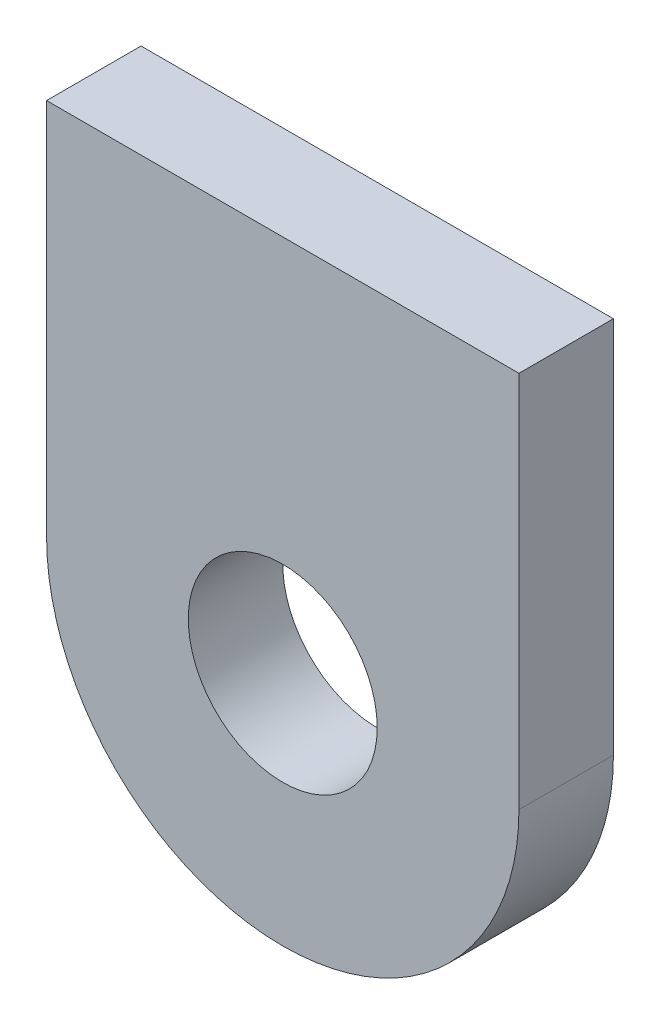
ISO-10303-21;
HEADER;
FILE_DESCRIPTION(('STEP AP214'),'2;1');
FILE_NAME('part.step','',(''),(''),'','','');
FILE_SCHEMA(('AUTOMOTIVE_DESIGN { 1 0 10303 214 1 1 1 1 }'));
ENDSEC;
DATA;
#1=APPLICATION_CONTEXT('core data for automotive mechanical design processes');
#2=APPLICATION_PROTOCOL_DEFINITION('international standard','automotive_design',2000,#1);
#3=PRODUCT_CONTEXT('',#1,'mechanical');
#4=PRODUCT('Part','Part','',(#3));
#5=PRODUCT_RELATED_PRODUCT_CATEGORY('part','',(#4));
#6=PRODUCT_DEFINITION_FORMATION('','',#4);
#7=PRODUCT_DEFINITION_CONTEXT('part definition',#1,'design');
#8=PRODUCT_DEFINITION('design','',#6,#7);
#9=PRODUCT_DEFINITION_SHAPE('','',#8);
#10=(LENGTH_UNIT() NAMED_UNIT(*) SI_UNIT(.MILLI.,.METRE.));
#11=(NAMED_UNIT(*) PLANE_ANGLE_UNIT() SI_UNIT($,.RADIAN.));
#12=(NAMED_UNIT(*) SI_UNIT($,.STERADIAN.) SOLID_ANGLE_UNIT());
#13=UNCERTAINTY_MEASURE_WITH_UNIT(LENGTH_MEASURE(1.E-05),#10,'distance_accuracy_value','');
#14=(GEOMETRIC_REPRESENTATION_CONTEXT(3) GLOBAL_UNCERTAINTY_ASSIGNED_CONTEXT((#13)) GLOBAL_UNIT_ASSIGNED_CONTEXT((#10,
#11,#12)) REPRESENTATION_CONTEXT('',''));
#15=CARTESIAN_POINT('',(0.,0.,0.));
#16=DIRECTION('',(0.,0.,1.));
#17=DIRECTION('',(1.,0.,0.));
#18=AXIS2_PLACEMENT_3D('',#15,#16,#17);
#19=CARTESIAN_POINT('',(0.,-120.,-30.));
#20=DIRECTION('',(-1.,0.,0.));
#21=DIRECTION('',(0.,0.,1.));
#22=AXIS2_PLACEMENT_3D('',#19,#20,#21);
#23=PLANE('',#22);
#24=DIRECTION('',(0.,-1.,0.));
#25=VECTOR('',#24,1.);
#26=CARTESIAN_POINT('',(0.,-120.,0.));
#27=LINE('',#26,#25);
#28=CARTESIAN_POINT('',(0.,0.,0.));
#29=VERTEX_POINT('',#28);
#30=CARTESIAN_POINT('',(0.,-120.,0.));
#31=VERTEX_POINT('',#30);
#32=EDGE_CURVE('E102',#29,#31,#27,.T.);
#33=ORIENTED_EDGE('',*,*,#32,.F.);
#34=DIRECTION('',(0.,0.,1.));
#35=VECTOR('',#34,1.);
#36=CARTESIAN_POINT('',(0.,0.,-30.));
#37=LINE('',#36,#35);
#38=CARTESIAN_POINT('',(0.,0.,-30.));
#39=VERTEX_POINT('',#38);
#40=EDGE_CURVE('E11',#39,#29,#37,.T.);
#41=ORIENTED_EDGE('',*,*,#40,.F.);
#42=DIRECTION('',(0.,-1.,0.));
#43=VECTOR('',#42,1.);
#44=CARTESIAN_POINT('',(0.,-120.,-30.));
#45=LINE('',#44,#43);
#46=CARTESIAN_POINT('',(0.,-120.,-30.));
#47=VERTEX_POINT('',#46);
#48=EDGE_CURVE('E95',#39,#47,#45,.T.);
#49=ORIENTED_EDGE('',*,*,#48,.T.);
#50=DIRECTION('',(0.,0.,1.));
#51=VECTOR('',#50,1.);
#52=CARTESIAN_POINT('',(0.,-120.,-30.));
#53=LINE('',#52,#51);
#54=EDGE_CURVE('E40',#47,#31,#53,.T.);
#55=ORIENTED_EDGE('',*,*,#54,.T.);
#56=EDGE_LOOP('',(#33,#41,#49,#55));
#57=FACE_BOUND('',#56,.T.);
#58=ADVANCED_FACE('F37',(#57),#23,.T.);
#59=CARTESIAN_POINT('',(0.,0.,-30.));
#60=DIRECTION('',(0.,1.,0.));
#61=DIRECTION('',(0.,0.,1.));
#62=AXIS2_PLACEMENT_3D('',#59,#60,#61);
#63=PLANE('',#62);
#64=DIRECTION('',(-1.,0.,0.));
#65=VECTOR('',#64,1.);
#66=CARTESIAN_POINT('',(0.,0.,0.));
#67=LINE('',#66,#65);
#68=CARTESIAN_POINT('',(150.,0.,0.));
#69=VERTEX_POINT('',#68);
#70=EDGE_CURVE('E97',#69,#29,#67,.T.);
#71=ORIENTED_EDGE('',*,*,#70,.F.);
#72=DIRECTION('',(0.,0.,1.));
#73=VECTOR('',#72,1.);
#74=CARTESIAN_POINT('',(150.,0.,-30.));
#75=LINE('',#74,#73);
#76=CARTESIAN_POINT('',(150.,0.,-30.));
#77=VERTEX_POINT('',#76);
#78=EDGE_CURVE('E46',#77,#69,#75,.T.);
#79=ORIENTED_EDGE('',*,*,#78,.F.);
#80=DIRECTION('',(-1.,0.,0.));
#81=VECTOR('',#80,1.);
#82=CARTESIAN_POINT('',(0.,0.,-30.));
#83=LINE('',#82,#81);
#84=EDGE_CURVE('E92',#77,#39,#83,.T.);
#85=ORIENTED_EDGE('',*,*,#84,.T.);
#86=ORIENTED_EDGE('',*,*,#40,.T.);
#87=EDGE_LOOP('',(#71,#79,#85,#86));
#88=FACE_BOUND('',#87,.T.);
#89=ADVANCED_FACE('F113',(#88),#63,.T.);
#90=CARTESIAN_POINT('',(150.,0.,-30.));
#91=DIRECTION('',(1.,0.,0.));
#92=DIRECTION('',(0.,1.,0.));
#93=AXIS2_PLACEMENT_3D('',#90,#91,#92);
#94=PLANE('',#93);
#95=DIRECTION('',(0.,1.,0.));
#96=VECTOR('',#95,1.);
#97=CARTESIAN_POINT('',(150.,0.,0.));
#98=LINE('',#97,#96);
#99=CARTESIAN_POINT('',(150.,-120.,0.));
#100=VERTEX_POINT('',#99);
#101=EDGE_CURVE('E87',#100,#69,#98,.T.);
#102=ORIENTED_EDGE('',*,*,#101,.F.);
#103=DIRECTION('',(0.,0.,1.));
#104=VECTOR('',#103,1.);
#105=CARTESIAN_POINT('',(150.,-120.,-30.));
#106=LINE('',#105,#104);
#107=CARTESIAN_POINT('',(150.,-120.,-30.));
#108=VERTEX_POINT('',#107);
#109=EDGE_CURVE('E82',#108,#100,#106,.T.);
#110=ORIENTED_EDGE('',*,*,#109,.F.);
#111=DIRECTION('',(0.,1.,0.));
#112=VECTOR('',#111,1.);
#113=CARTESIAN_POINT('',(150.,0.,-30.));
#114=LINE('',#113,#112);
#115=EDGE_CURVE('E85',#108,#77,#114,.T.);
#116=ORIENTED_EDGE('',*,*,#115,.T.);
#117=ORIENTED_EDGE('',*,*,#78,.T.);
#118=EDGE_LOOP('',(#102,#110,#116,#117));
#119=FACE_BOUND('',#118,.T.);
#120=ADVANCED_FACE('F84',(#119),#94,.T.);
#121=CARTESIAN_POINT('',(75.,-120.,-30.));
#122=DIRECTION('',(0.,0.,1.));
#123=DIRECTION('',(1.,0.,0.));
#124=AXIS2_PLACEMENT_3D('',#121,#122,#123);
#125=CYLINDRICAL_SURFACE('',#124,75.);
#126=CARTESIAN_POINT('',(75.,-120.,0.));
#127=DIRECTION('',(0.,0.,1.));
#128=DIRECTION('',(-1.,0.,0.));
#129=AXIS2_PLACEMENT_3D('',#126,#127,#128);
#130=CIRCLE('',#129,75.);
#131=EDGE_CURVE('E105',#31,#100,#130,.T.);
#132=ORIENTED_EDGE('',*,*,#131,.F.);
#133=ORIENTED_EDGE('',*,*,#54,.F.);
#134=CARTESIAN_POINT('',(75.,-120.,-30.));
#135=DIRECTION('',(0.,0.,1.));
#136=DIRECTION('',(-1.,0.,0.));
#137=AXIS2_PLACEMENT_3D('',#134,#135,#136);
#138=CIRCLE('',#137,75.);
#139=EDGE_CURVE('E91',#47,#108,#138,.T.);
#140=ORIENTED_EDGE('',*,*,#139,.T.);
#141=ORIENTED_EDGE('',*,*,#109,.T.);
#142=EDGE_LOOP('',(#132,#133,#140,#141));
#143=FACE_BOUND('',#142,.T.);
#144=ADVANCED_FACE('F94',(#143),#125,.T.);
#145=CARTESIAN_POINT('',(75.,-120.,-30.));
#146=DIRECTION('',(0.,0.,-1.));
#147=DIRECTION('',(-1.,0.,0.));
#148=AXIS2_PLACEMENT_3D('',#145,#146,#147);
#149=PLANE('',#148);
#150=CARTESIAN_POINT('',(75.,-120.,-30.));
#151=DIRECTION('',(0.,0.,1.));
#152=DIRECTION('',(1.,0.,0.));
#153=AXIS2_PLACEMENT_3D('',#150,#151,#152);
#154=CIRCLE('',#153,30.);
#155=CARTESIAN_POINT('',(105.,-120.,-30.));
#156=VERTEX_POINT('',#155);
#157=EDGE_CURVE('E106',#156,#156,#154,.T.);
#158=ORIENTED_EDGE('',*,*,#157,.T.);
#159=EDGE_LOOP('',(#158));
#160=FACE_BOUND('',#159,.T.);
#161=ORIENTED_EDGE('',*,*,#48,.F.);
#162=ORIENTED_EDGE('',*,*,#84,.F.);
#163=ORIENTED_EDGE('',*,*,#115,.F.);
#164=ORIENTED_EDGE('',*,*,#139,.F.);
#165=EDGE_LOOP('',(#161,#162,#163,#164));
#166=FACE_BOUND('',#165,.T.);
#167=ADVANCED_FACE('F90',(#160,#166),#149,.T.);
#168=CARTESIAN_POINT('',(75.,-120.,0.));
#169=DIRECTION('',(0.,0.,-1.));
#170=DIRECTION('',(-1.,0.,0.));
#171=AXIS2_PLACEMENT_3D('',#168,#169,#170);
#172=PLANE('',#171);
#173=CARTESIAN_POINT('',(75.,-120.,0.));
#174=DIRECTION('',(0.,0.,1.));
#175=DIRECTION('',(1.,0.,0.));
#176=AXIS2_PLACEMENT_3D('',#173,#174,#175);
#177=CIRCLE('',#176,30.);
#178=CARTESIAN_POINT('',(105.,-120.,0.));
#179=VERTEX_POINT('',#178);
#180=EDGE_CURVE('E143',#179,#179,#177,.T.);
#181=ORIENTED_EDGE('',*,*,#180,.F.);
#182=EDGE_LOOP('',(#181));
#183=FACE_BOUND('',#182,.T.);
#184=ORIENTED_EDGE('',*,*,#32,.T.);
#185=ORIENTED_EDGE('',*,*,#131,.T.);
#186=ORIENTED_EDGE('',*,*,#101,.T.);
#187=ORIENTED_EDGE('',*,*,#70,.T.);
#188=EDGE_LOOP('',(#184,#185,#186,#187));
#189=FACE_BOUND('',#188,.T.);
#190=ADVANCED_FACE('F112',(#183,#189),#172,.F.);
#191=CARTESIAN_POINT('',(75.,-120.,-30.));
#192=DIRECTION('',(0.,0.,1.));
#193=DIRECTION('',(1.,0.,0.));
#194=AXIS2_PLACEMENT_3D('',#191,#192,#193);
#195=CYLINDRICAL_SURFACE('',#194,30.);
#196=ORIENTED_EDGE('',*,*,#157,.F.);
#197=EDGE_LOOP('',(#196));
#198=FACE_BOUND('',#197,.T.);
#199=ORIENTED_EDGE('',*,*,#180,.T.);
#200=EDGE_LOOP('',(#199));
#201=FACE_BOUND('',#200,.T.);
#202=ADVANCED_FACE('F131',(#198,#201),#195,.F.);
#203=CLOSED_SHELL('',(#58,#89,#120,#144,#167,#190,#202));
#204=MANIFOLD_SOLID_BREP('B2',#203);
#205=ADVANCED_BREP_SHAPE_REPRESENTATION('',(#18,#204),#14);
#206=SHAPE_DEFINITION_REPRESENTATION(#9,#205);
ENDSEC;
END-ISO-10303-21;
